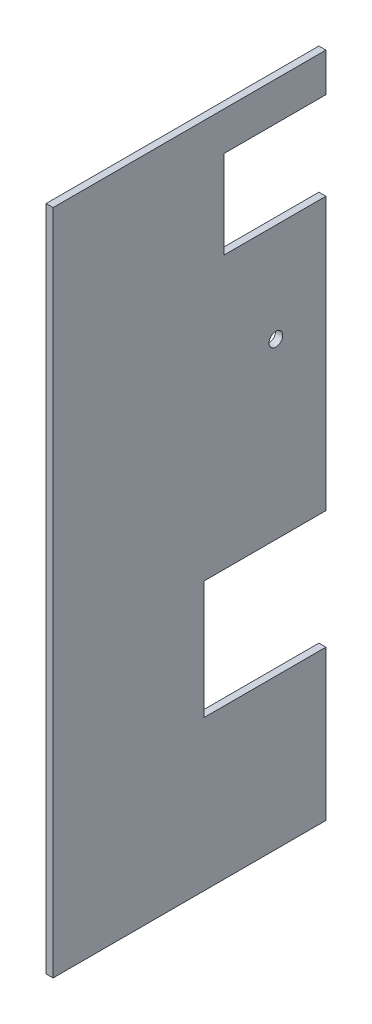
ISO-10303-21;
HEADER;
FILE_DESCRIPTION(('STEP AP214'),'2;1');
FILE_NAME('part.step','',(''),(''),'','','');
FILE_SCHEMA(('AUTOMOTIVE_DESIGN { 1 0 10303 214 1 1 1 1 }'));
ENDSEC;
DATA;
#1=APPLICATION_CONTEXT('core data for automotive mechanical design processes');
#2=APPLICATION_PROTOCOL_DEFINITION('international standard','automotive_design',2000,#1);
#3=PRODUCT_CONTEXT('',#1,'mechanical');
#4=PRODUCT('Part','Part','',(#3));
#5=PRODUCT_RELATED_PRODUCT_CATEGORY('part','',(#4));
#6=PRODUCT_DEFINITION_FORMATION('','',#4);
#7=PRODUCT_DEFINITION_CONTEXT('part definition',#1,'design');
#8=PRODUCT_DEFINITION('design','',#6,#7);
#9=PRODUCT_DEFINITION_SHAPE('','',#8);
#10=(LENGTH_UNIT() NAMED_UNIT(*) SI_UNIT(.MILLI.,.METRE.));
#11=(NAMED_UNIT(*) PLANE_ANGLE_UNIT() SI_UNIT($,.RADIAN.));
#12=(NAMED_UNIT(*) SI_UNIT($,.STERADIAN.) SOLID_ANGLE_UNIT());
#13=UNCERTAINTY_MEASURE_WITH_UNIT(LENGTH_MEASURE(1.E-05),#10,'distance_accuracy_value','');
#14=(GEOMETRIC_REPRESENTATION_CONTEXT(3) GLOBAL_UNCERTAINTY_ASSIGNED_CONTEXT((#13)) GLOBAL_UNIT_ASSIGNED_CONTEXT((#10,
#11,#12)) REPRESENTATION_CONTEXT('',''));
#15=CARTESIAN_POINT('',(0.,0.,0.));
#16=DIRECTION('',(0.,0.,1.));
#17=DIRECTION('',(1.,0.,0.));
#18=AXIS2_PLACEMENT_3D('',#15,#16,#17);
#19=CARTESIAN_POINT('',(1.,100.85,3.40000000000002));
#20=DIRECTION('',(0.,0.,-1.));
#21=DIRECTION('',(0.,1.,0.));
#22=AXIS2_PLACEMENT_3D('',#19,#20,#21);
#23=PLANE('',#22);
#24=DIRECTION('',(1.,0.,0.));
#25=VECTOR('',#24,1.);
#26=CARTESIAN_POINT('',(1.,44.0541887999081,3.40000000000002));
#27=LINE('',#26,#25);
#28=CARTESIAN_POINT('',(0.,44.0541887999081,3.40000000000002));
#29=VERTEX_POINT('',#28);
#30=CARTESIAN_POINT('',(1.,44.0541887999081,3.40000000000002));
#31=VERTEX_POINT('',#30);
#32=EDGE_CURVE('E155',#29,#31,#27,.T.);
#33=ORIENTED_EDGE('',*,*,#32,.F.);
#34=DIRECTION('',(0.,-1.,0.));
#35=VECTOR('',#34,1.);
#36=CARTESIAN_POINT('',(0.,5.85000000000011,3.40000000000002));
#37=LINE('',#36,#35);
#38=CARTESIAN_POINT('',(0.,82.8282879792373,3.40000000000002));
#39=VERTEX_POINT('',#38);
#40=EDGE_CURVE('E189',#39,#29,#37,.T.);
#41=ORIENTED_EDGE('',*,*,#40,.F.);
#42=DIRECTION('',(-1.,0.,0.));
#43=VECTOR('',#42,1.);
#44=CARTESIAN_POINT('',(1.,82.8282879792374,3.40000000000002));
#45=LINE('',#44,#43);
#46=CARTESIAN_POINT('',(1.,82.8282879792374,3.40000000000002));
#47=VERTEX_POINT('',#46);
#48=EDGE_CURVE('E54',#47,#39,#45,.T.);
#49=ORIENTED_EDGE('',*,*,#48,.F.);
#50=DIRECTION('',(0.,-1.,0.));
#51=VECTOR('',#50,1.);
#52=CARTESIAN_POINT('',(1.,100.85,3.40000000000002));
#53=LINE('',#52,#51);
#54=EDGE_CURVE('E206',#47,#31,#53,.T.);
#55=ORIENTED_EDGE('',*,*,#54,.T.);
#56=EDGE_LOOP('',(#33,#41,#49,#55));
#57=FACE_BOUND('',#56,.T.);
#58=ADVANCED_FACE('F32',(#57),#23,.T.);
#59=DIRECTION('',(1.,0.,0.));
#60=VECTOR('',#59,1.);
#61=CARTESIAN_POINT('',(1.,95.3456735665245,3.40000000000002));
#62=LINE('',#61,#60);
#63=CARTESIAN_POINT('',(0.,95.3456735665245,3.40000000000002));
#64=VERTEX_POINT('',#63);
#65=CARTESIAN_POINT('',(1.,95.3456735665245,3.40000000000002));
#66=VERTEX_POINT('',#65);
#67=EDGE_CURVE('E176',#64,#66,#62,.T.);
#68=ORIENTED_EDGE('',*,*,#67,.F.);
#69=CARTESIAN_POINT('',(0.,100.85,3.40000000000002));
#70=VERTEX_POINT('',#69);
#71=EDGE_CURVE('E185',#70,#64,#37,.T.);
#72=ORIENTED_EDGE('',*,*,#71,.F.);
#73=DIRECTION('',(-1.,0.,0.));
#74=VECTOR('',#73,1.);
#75=CARTESIAN_POINT('',(1.,100.85,3.40000000000002));
#76=LINE('',#75,#74);
#77=CARTESIAN_POINT('',(1.,100.85,3.40000000000002));
#78=VERTEX_POINT('',#77);
#79=EDGE_CURVE('E210',#78,#70,#76,.T.);
#80=ORIENTED_EDGE('',*,*,#79,.F.);
#81=EDGE_CURVE('E202',#78,#66,#53,.T.);
#82=ORIENTED_EDGE('',*,*,#81,.T.);
#83=EDGE_LOOP('',(#68,#72,#80,#82));
#84=FACE_BOUND('',#83,.T.);
#85=ADVANCED_FACE('F243',(#84),#23,.T.);
#86=CARTESIAN_POINT('',(1.,5.85000000000011,3.40000000000003));
#87=DIRECTION('',(0.,-1.,0.));
#88=DIRECTION('',(0.,0.,-1.));
#89=AXIS2_PLACEMENT_3D('',#86,#87,#88);
#90=PLANE('',#89);
#91=DIRECTION('',(-1.,0.,0.));
#92=VECTOR('',#91,1.);
#93=CARTESIAN_POINT('',(1.,5.85000000000012,42.25));
#94=LINE('',#93,#92);
#95=CARTESIAN_POINT('',(1.,5.85000000000012,42.25));
#96=VERTEX_POINT('',#95);
#97=CARTESIAN_POINT('',(0.,5.85000000000012,42.25));
#98=VERTEX_POINT('',#97);
#99=EDGE_CURVE('E205',#96,#98,#94,.T.);
#100=ORIENTED_EDGE('',*,*,#99,.T.);
#101=DIRECTION('',(0.,0.,1.));
#102=VECTOR('',#101,1.);
#103=CARTESIAN_POINT('',(0.,5.85000000000012,42.25));
#104=LINE('',#103,#102);
#105=CARTESIAN_POINT('',(0.,5.85000000000011,3.40000000000002));
#106=VERTEX_POINT('',#105);
#107=EDGE_CURVE('E188',#106,#98,#104,.T.);
#108=ORIENTED_EDGE('',*,*,#107,.F.);
#109=DIRECTION('',(-1.,0.,0.));
#110=VECTOR('',#109,1.);
#111=CARTESIAN_POINT('',(1.,5.85000000000011,3.40000000000003));
#112=LINE('',#111,#110);
#113=CARTESIAN_POINT('',(1.,5.85000000000011,3.40000000000003));
#114=VERTEX_POINT('',#113);
#115=EDGE_CURVE('E207',#114,#106,#112,.T.);
#116=ORIENTED_EDGE('',*,*,#115,.F.);
#117=DIRECTION('',(0.,0.,1.));
#118=VECTOR('',#117,1.);
#119=CARTESIAN_POINT('',(1.,5.85000000000011,3.40000000000003));
#120=LINE('',#119,#118);
#121=EDGE_CURVE('E192',#114,#96,#120,.T.);
#122=ORIENTED_EDGE('',*,*,#121,.T.);
#123=EDGE_LOOP('',(#100,#108,#116,#122));
#124=FACE_BOUND('',#123,.T.);
#125=ADVANCED_FACE('F34',(#124),#90,.T.);
#126=DIRECTION('',(-1.,0.,0.));
#127=VECTOR('',#126,1.);
#128=CARTESIAN_POINT('',(1.,27.2212695874251,3.40000000000003));
#129=LINE('',#128,#127);
#130=CARTESIAN_POINT('',(1.,27.2212695874251,3.40000000000002));
#131=VERTEX_POINT('',#130);
#132=CARTESIAN_POINT('',(0.,27.2212695874251,3.40000000000002));
#133=VERTEX_POINT('',#132);
#134=EDGE_CURVE('E47',#131,#133,#129,.T.);
#135=ORIENTED_EDGE('',*,*,#134,.F.);
#136=EDGE_CURVE('E201',#131,#114,#53,.T.);
#137=ORIENTED_EDGE('',*,*,#136,.T.);
#138=ORIENTED_EDGE('',*,*,#115,.T.);
#139=EDGE_CURVE('E184',#133,#106,#37,.T.);
#140=ORIENTED_EDGE('',*,*,#139,.F.);
#141=EDGE_LOOP('',(#135,#137,#138,#140));
#142=FACE_BOUND('',#141,.T.);
#143=ADVANCED_FACE('F226',(#142),#23,.T.);
#144=CARTESIAN_POINT('',(1.,100.85,42.25));
#145=DIRECTION('',(0.,1.,0.));
#146=DIRECTION('',(0.,0.,1.));
#147=AXIS2_PLACEMENT_3D('',#144,#145,#146);
#148=PLANE('',#147);
#149=ORIENTED_EDGE('',*,*,#79,.T.);
#150=DIRECTION('',(0.,0.,-1.));
#151=VECTOR('',#150,1.);
#152=CARTESIAN_POINT('',(0.,100.85,3.40000000000002));
#153=LINE('',#152,#151);
#154=CARTESIAN_POINT('',(0.,100.85,42.25));
#155=VERTEX_POINT('',#154);
#156=EDGE_CURVE('E181',#155,#70,#153,.T.);
#157=ORIENTED_EDGE('',*,*,#156,.F.);
#158=DIRECTION('',(-1.,0.,0.));
#159=VECTOR('',#158,1.);
#160=CARTESIAN_POINT('',(1.,100.85,42.25));
#161=LINE('',#160,#159);
#162=CARTESIAN_POINT('',(1.,100.85,42.25));
#163=VERTEX_POINT('',#162);
#164=EDGE_CURVE('E212',#163,#155,#161,.T.);
#165=ORIENTED_EDGE('',*,*,#164,.F.);
#166=DIRECTION('',(0.,0.,-1.));
#167=VECTOR('',#166,1.);
#168=CARTESIAN_POINT('',(1.,100.85,42.25));
#169=LINE('',#168,#167);
#170=EDGE_CURVE('E198',#163,#78,#169,.T.);
#171=ORIENTED_EDGE('',*,*,#170,.T.);
#172=EDGE_LOOP('',(#149,#157,#165,#171));
#173=FACE_BOUND('',#172,.T.);
#174=ADVANCED_FACE('F238',(#173),#148,.T.);
#175=CARTESIAN_POINT('',(1.,5.85000000000012,42.25));
#176=DIRECTION('',(0.,0.,1.));
#177=DIRECTION('',(0.,-1.,0.));
#178=AXIS2_PLACEMENT_3D('',#175,#176,#177);
#179=PLANE('',#178);
#180=ORIENTED_EDGE('',*,*,#164,.T.);
#181=DIRECTION('',(0.,1.,0.));
#182=VECTOR('',#181,1.);
#183=CARTESIAN_POINT('',(0.,100.85,42.25));
#184=LINE('',#183,#182);
#185=EDGE_CURVE('E178',#98,#155,#184,.T.);
#186=ORIENTED_EDGE('',*,*,#185,.F.);
#187=ORIENTED_EDGE('',*,*,#99,.F.);
#188=DIRECTION('',(0.,1.,0.));
#189=VECTOR('',#188,1.);
#190=CARTESIAN_POINT('',(1.,5.85000000000012,42.25));
#191=LINE('',#190,#189);
#192=EDGE_CURVE('E195',#96,#163,#191,.T.);
#193=ORIENTED_EDGE('',*,*,#192,.T.);
#194=EDGE_LOOP('',(#180,#186,#187,#193));
#195=FACE_BOUND('',#194,.T.);
#196=ADVANCED_FACE('F232',(#195),#179,.T.);
#197=CARTESIAN_POINT('',(1.,0.,0.));
#198=DIRECTION('',(-1.,0.,0.));
#199=DIRECTION('',(0.,0.,1.));
#200=AXIS2_PLACEMENT_3D('',#197,#198,#199);
#201=PLANE('',#200);
#202=CARTESIAN_POINT('',(1.,68.7632709832806,10.5270308721623));
#203=DIRECTION('',(-1.,0.,0.));
#204=DIRECTION('',(0.,0.,1.));
#205=AXIS2_PLACEMENT_3D('',#202,#203,#204);
#206=CIRCLE('',#205,0.973496531265039);
#207=CARTESIAN_POINT('',(1.,68.7632709832806,11.5005274034273));
#208=VERTEX_POINT('',#207);
#209=EDGE_CURVE('E139',#208,#208,#206,.T.);
#210=ORIENTED_EDGE('',*,*,#209,.T.);
#211=EDGE_LOOP('',(#210));
#212=FACE_BOUND('',#211,.T.);
#213=DIRECTION('',(0.,1.,0.));
#214=VECTOR('',#213,1.);
#215=CARTESIAN_POINT('',(1.,0.,20.7457446257977));
#216=LINE('',#215,#214);
#217=CARTESIAN_POINT('',(1.,27.2212695874251,20.7457446257977));
#218=VERTEX_POINT('',#217);
#219=CARTESIAN_POINT('',(1.,44.0541887999081,20.7457446257977));
#220=VERTEX_POINT('',#219);
#221=EDGE_CURVE('E129',#218,#220,#216,.T.);
#222=ORIENTED_EDGE('',*,*,#221,.T.);
#223=DIRECTION('',(0.,0.,-1.));
#224=VECTOR('',#223,1.);
#225=CARTESIAN_POINT('',(1.,44.0541887999081,0.));
#226=LINE('',#225,#224);
#227=EDGE_CURVE('E152',#220,#31,#226,.T.);
#228=ORIENTED_EDGE('',*,*,#227,.T.);
#229=ORIENTED_EDGE('',*,*,#54,.F.);
#230=DIRECTION('',(0.,0.,1.));
#231=VECTOR('',#230,1.);
#232=CARTESIAN_POINT('',(1.,82.8282879792374,0.));
#233=LINE('',#232,#231);
#234=CARTESIAN_POINT('',(1.,82.8282879792374,17.9186094846061));
#235=VERTEX_POINT('',#234);
#236=EDGE_CURVE('E165',#47,#235,#233,.T.);
#237=ORIENTED_EDGE('',*,*,#236,.T.);
#238=DIRECTION('',(0.,1.,0.));
#239=VECTOR('',#238,1.);
#240=CARTESIAN_POINT('',(1.,0.,17.9186094846061));
#241=LINE('',#240,#239);
#242=CARTESIAN_POINT('',(1.,95.3456735665245,17.9186094846061));
#243=VERTEX_POINT('',#242);
#244=EDGE_CURVE('E170',#235,#243,#241,.T.);
#245=ORIENTED_EDGE('',*,*,#244,.T.);
#246=DIRECTION('',(0.,0.,-1.));
#247=VECTOR('',#246,1.);
#248=CARTESIAN_POINT('',(1.,95.3456735665245,0.));
#249=LINE('',#248,#247);
#250=EDGE_CURVE('E173',#243,#66,#249,.T.);
#251=ORIENTED_EDGE('',*,*,#250,.T.);
#252=ORIENTED_EDGE('',*,*,#81,.F.);
#253=ORIENTED_EDGE('',*,*,#170,.F.);
#254=ORIENTED_EDGE('',*,*,#192,.F.);
#255=ORIENTED_EDGE('',*,*,#121,.F.);
#256=ORIENTED_EDGE('',*,*,#136,.F.);
#257=DIRECTION('',(0.,0.,1.));
#258=VECTOR('',#257,1.);
#259=CARTESIAN_POINT('',(1.,27.2212695874251,0.));
#260=LINE('',#259,#258);
#261=EDGE_CURVE('E147',#131,#218,#260,.T.);
#262=ORIENTED_EDGE('',*,*,#261,.T.);
#263=EDGE_LOOP('',(#222,#228,#229,#237,#245,#251,#252,#253,#254,#255,#256,#262));
#264=FACE_BOUND('',#263,.T.);
#265=ADVANCED_FACE('F235',(#212,#264),#201,.F.);
#266=CARTESIAN_POINT('',(0.,0.,0.));
#267=DIRECTION('',(1.,0.,0.));
#268=DIRECTION('',(0.,0.,-1.));
#269=AXIS2_PLACEMENT_3D('',#266,#267,#268);
#270=PLANE('',#269);
#271=CARTESIAN_POINT('',(0.,68.7632709832806,10.5270308721623));
#272=DIRECTION('',(-1.,0.,0.));
#273=DIRECTION('',(0.,0.,1.));
#274=AXIS2_PLACEMENT_3D('',#271,#272,#273);
#275=CIRCLE('',#274,0.973496531265039);
#276=CARTESIAN_POINT('',(0.,68.7632709832806,11.5005274034273));
#277=VERTEX_POINT('',#276);
#278=EDGE_CURVE('E143',#277,#277,#275,.T.);
#279=ORIENTED_EDGE('',*,*,#278,.F.);
#280=EDGE_LOOP('',(#279));
#281=FACE_BOUND('',#280,.T.);
#282=ORIENTED_EDGE('',*,*,#40,.T.);
#283=DIRECTION('',(0.,0.,-1.));
#284=VECTOR('',#283,1.);
#285=CARTESIAN_POINT('',(0.,44.0541887999081,-2.32815231355649));
#286=LINE('',#285,#284);
#287=CARTESIAN_POINT('',(0.,44.0541887999081,20.7457446257977));
#288=VERTEX_POINT('',#287);
#289=EDGE_CURVE('E132',#288,#29,#286,.T.);
#290=ORIENTED_EDGE('',*,*,#289,.F.);
#291=DIRECTION('',(0.,1.,0.));
#292=VECTOR('',#291,1.);
#293=CARTESIAN_POINT('',(0.,27.2212695874251,20.7457446257977));
#294=LINE('',#293,#292);
#295=CARTESIAN_POINT('',(0.,27.2212695874251,20.7457446257977));
#296=VERTEX_POINT('',#295);
#297=EDGE_CURVE('E126',#296,#288,#294,.T.);
#298=ORIENTED_EDGE('',*,*,#297,.F.);
#299=DIRECTION('',(0.,0.,-1.));
#300=VECTOR('',#299,1.);
#301=CARTESIAN_POINT('',(0.,27.2212695874251,0.));
#302=LINE('',#301,#300);
#303=EDGE_CURVE('E11',#296,#133,#302,.T.);
#304=ORIENTED_EDGE('',*,*,#303,.T.);
#305=ORIENTED_EDGE('',*,*,#139,.T.);
#306=ORIENTED_EDGE('',*,*,#107,.T.);
#307=ORIENTED_EDGE('',*,*,#185,.T.);
#308=ORIENTED_EDGE('',*,*,#156,.T.);
#309=ORIENTED_EDGE('',*,*,#71,.T.);
#310=DIRECTION('',(0.,0.,-1.));
#311=VECTOR('',#310,1.);
#312=CARTESIAN_POINT('',(0.,95.3456735665245,-2.14654110551636));
#313=LINE('',#312,#311);
#314=CARTESIAN_POINT('',(0.,95.3456735665245,17.9186094846061));
#315=VERTEX_POINT('',#314);
#316=EDGE_CURVE('E160',#315,#64,#313,.T.);
#317=ORIENTED_EDGE('',*,*,#316,.F.);
#318=DIRECTION('',(0.,1.,0.));
#319=VECTOR('',#318,1.);
#320=CARTESIAN_POINT('',(0.,82.8282879792374,17.9186094846061));
#321=LINE('',#320,#319);
#322=CARTESIAN_POINT('',(0.,82.8282879792374,17.9186094846061));
#323=VERTEX_POINT('',#322);
#324=EDGE_CURVE('E157',#323,#315,#321,.T.);
#325=ORIENTED_EDGE('',*,*,#324,.F.);
#326=DIRECTION('',(0.,0.,-1.));
#327=VECTOR('',#326,1.);
#328=CARTESIAN_POINT('',(0.,82.8282879792374,0.));
#329=LINE('',#328,#327);
#330=EDGE_CURVE('E40',#323,#39,#329,.T.);
#331=ORIENTED_EDGE('',*,*,#330,.T.);
#332=EDGE_LOOP('',(#282,#290,#298,#304,#305,#306,#307,#308,#309,#317,#325,#331));
#333=FACE_BOUND('',#332,.T.);
#334=ADVANCED_FACE('F138',(#281,#333),#270,.F.);
#335=CARTESIAN_POINT('',(3.,82.8282879792374,17.9186094846061));
#336=DIRECTION('',(0.,0.,1.));
#337=DIRECTION('',(1.,0.,0.));
#338=AXIS2_PLACEMENT_3D('',#335,#336,#337);
#339=PLANE('',#338);
#340=DIRECTION('',(-1.,0.,0.));
#341=VECTOR('',#340,1.);
#342=CARTESIAN_POINT('',(3.,82.8282879792374,17.9186094846061));
#343=LINE('',#342,#341);
#344=EDGE_CURVE('E162',#235,#323,#343,.T.);
#345=ORIENTED_EDGE('',*,*,#344,.T.);
#346=ORIENTED_EDGE('',*,*,#324,.T.);
#347=DIRECTION('',(-1.,0.,0.));
#348=VECTOR('',#347,1.);
#349=CARTESIAN_POINT('',(3.,95.3456735665245,17.9186094846061));
#350=LINE('',#349,#348);
#351=EDGE_CURVE('E163',#243,#315,#350,.T.);
#352=ORIENTED_EDGE('',*,*,#351,.F.);
#353=ORIENTED_EDGE('',*,*,#244,.F.);
#354=EDGE_LOOP('',(#345,#346,#352,#353));
#355=FACE_BOUND('',#354,.T.);
#356=ADVANCED_FACE('F248',(#355),#339,.F.);
#357=CARTESIAN_POINT('',(3.,95.3456735665245,-2.14654110551636));
#358=DIRECTION('',(0.,1.,0.));
#359=DIRECTION('',(0.,0.,1.));
#360=AXIS2_PLACEMENT_3D('',#357,#358,#359);
#361=PLANE('',#360);
#362=ORIENTED_EDGE('',*,*,#67,.T.);
#363=ORIENTED_EDGE('',*,*,#250,.F.);
#364=ORIENTED_EDGE('',*,*,#351,.T.);
#365=ORIENTED_EDGE('',*,*,#316,.T.);
#366=EDGE_LOOP('',(#362,#363,#364,#365));
#367=FACE_BOUND('',#366,.T.);
#368=ADVANCED_FACE('F245',(#367),#361,.F.);
#369=CARTESIAN_POINT('',(3.,82.8282879792374,-2.14654110551636));
#370=DIRECTION('',(0.,-1.,0.));
#371=DIRECTION('',(0.,0.,-1.));
#372=AXIS2_PLACEMENT_3D('',#369,#370,#371);
#373=PLANE('',#372);
#374=ORIENTED_EDGE('',*,*,#48,.T.);
#375=ORIENTED_EDGE('',*,*,#330,.F.);
#376=ORIENTED_EDGE('',*,*,#344,.F.);
#377=ORIENTED_EDGE('',*,*,#236,.F.);
#378=EDGE_LOOP('',(#374,#375,#376,#377));
#379=FACE_BOUND('',#378,.T.);
#380=ADVANCED_FACE('F249',(#379),#373,.F.);
#381=CARTESIAN_POINT('',(3.,27.2212695874251,20.7457446257977));
#382=DIRECTION('',(0.,0.,1.));
#383=DIRECTION('',(0.,-1.,0.));
#384=AXIS2_PLACEMENT_3D('',#381,#382,#383);
#385=PLANE('',#384);
#386=DIRECTION('',(-1.,0.,0.));
#387=VECTOR('',#386,1.);
#388=CARTESIAN_POINT('',(3.,27.2212695874251,20.7457446257977));
#389=LINE('',#388,#387);
#390=EDGE_CURVE('E122',#218,#296,#389,.T.);
#391=ORIENTED_EDGE('',*,*,#390,.T.);
#392=ORIENTED_EDGE('',*,*,#297,.T.);
#393=DIRECTION('',(-1.,0.,0.));
#394=VECTOR('',#393,1.);
#395=CARTESIAN_POINT('',(3.,44.0541887999081,20.7457446257977));
#396=LINE('',#395,#394);
#397=EDGE_CURVE('E131',#220,#288,#396,.T.);
#398=ORIENTED_EDGE('',*,*,#397,.F.);
#399=ORIENTED_EDGE('',*,*,#221,.F.);
#400=EDGE_LOOP('',(#391,#392,#398,#399));
#401=FACE_BOUND('',#400,.T.);
#402=ADVANCED_FACE('F123',(#401),#385,.F.);
#403=CARTESIAN_POINT('',(3.,44.0541887999081,-2.32815231355649));
#404=DIRECTION('',(0.,1.,0.));
#405=DIRECTION('',(0.,0.,1.));
#406=AXIS2_PLACEMENT_3D('',#403,#404,#405);
#407=PLANE('',#406);
#408=ORIENTED_EDGE('',*,*,#32,.T.);
#409=ORIENTED_EDGE('',*,*,#227,.F.);
#410=ORIENTED_EDGE('',*,*,#397,.T.);
#411=ORIENTED_EDGE('',*,*,#289,.T.);
#412=EDGE_LOOP('',(#408,#409,#410,#411));
#413=FACE_BOUND('',#412,.T.);
#414=ADVANCED_FACE('F256',(#413),#407,.F.);
#415=CARTESIAN_POINT('',(3.,27.2212695874251,-2.32815231355649));
#416=DIRECTION('',(0.,-1.,0.));
#417=DIRECTION('',(0.,0.,-1.));
#418=AXIS2_PLACEMENT_3D('',#415,#416,#417);
#419=PLANE('',#418);
#420=ORIENTED_EDGE('',*,*,#134,.T.);
#421=ORIENTED_EDGE('',*,*,#303,.F.);
#422=ORIENTED_EDGE('',*,*,#390,.F.);
#423=ORIENTED_EDGE('',*,*,#261,.F.);
#424=EDGE_LOOP('',(#420,#421,#422,#423));
#425=FACE_BOUND('',#424,.T.);
#426=ADVANCED_FACE('F134',(#425),#419,.F.);
#427=CARTESIAN_POINT('',(3.,68.7632709832806,10.5270308721623));
#428=DIRECTION('',(-1.,0.,0.));
#429=DIRECTION('',(0.,0.,1.));
#430=AXIS2_PLACEMENT_3D('',#427,#428,#429);
#431=CYLINDRICAL_SURFACE('',#430,0.973496531265039);
#432=ORIENTED_EDGE('',*,*,#278,.T.);
#433=EDGE_LOOP('',(#432));
#434=FACE_BOUND('',#433,.T.);
#435=ORIENTED_EDGE('',*,*,#209,.F.);
#436=EDGE_LOOP('',(#435));
#437=FACE_BOUND('',#436,.T.);
#438=ADVANCED_FACE('F338',(#434,#437),#431,.F.);
#439=CLOSED_SHELL('',(#58,#85,#125,#143,#174,#196,#265,#334,#356,#368,#380,#402,#414,#426,#438));
#440=MANIFOLD_SOLID_BREP('B2',#439);
#441=ADVANCED_BREP_SHAPE_REPRESENTATION('',(#18,#440),#14);
#442=SHAPE_DEFINITION_REPRESENTATION(#9,#441);
ENDSEC;
END-ISO-10303-21;
